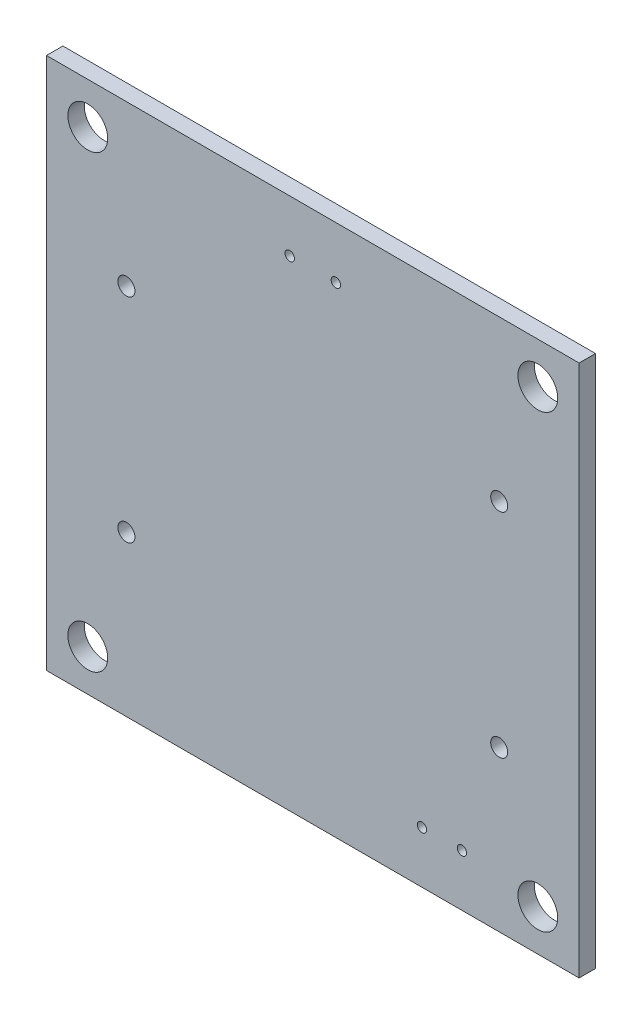
ISO-10303-21;
HEADER;
FILE_DESCRIPTION(('STEP AP214'),'2;1');
FILE_NAME('part.step','',(''),(''),'','','');
FILE_SCHEMA(('AUTOMOTIVE_DESIGN { 1 0 10303 214 1 1 1 1 }'));
ENDSEC;
DATA;
#1=APPLICATION_CONTEXT('core data for automotive mechanical design processes');
#2=APPLICATION_PROTOCOL_DEFINITION('international standard','automotive_design',2000,#1);
#3=PRODUCT_CONTEXT('',#1,'mechanical');
#4=PRODUCT('Part','Part','',(#3));
#5=PRODUCT_RELATED_PRODUCT_CATEGORY('part','',(#4));
#6=PRODUCT_DEFINITION_FORMATION('','',#4);
#7=PRODUCT_DEFINITION_CONTEXT('part definition',#1,'design');
#8=PRODUCT_DEFINITION('design','',#6,#7);
#9=PRODUCT_DEFINITION_SHAPE('','',#8);
#10=(LENGTH_UNIT() NAMED_UNIT(*) SI_UNIT(.MILLI.,.METRE.));
#11=(NAMED_UNIT(*) PLANE_ANGLE_UNIT() SI_UNIT($,.RADIAN.));
#12=(NAMED_UNIT(*) SI_UNIT($,.STERADIAN.) SOLID_ANGLE_UNIT());
#13=UNCERTAINTY_MEASURE_WITH_UNIT(LENGTH_MEASURE(1.E-05),#10,'distance_accuracy_value','');
#14=(GEOMETRIC_REPRESENTATION_CONTEXT(3) GLOBAL_UNCERTAINTY_ASSIGNED_CONTEXT((#13)) GLOBAL_UNIT_ASSIGNED_CONTEXT((#10,
#11,#12)) REPRESENTATION_CONTEXT('',''));
#15=CARTESIAN_POINT('',(0.,0.,0.));
#16=DIRECTION('',(0.,0.,1.));
#17=DIRECTION('',(1.,0.,0.));
#18=AXIS2_PLACEMENT_3D('',#15,#16,#17);
#19=CARTESIAN_POINT('',(0.,0.,1.56464));
#20=DIRECTION('',(0.,0.,1.));
#21=DIRECTION('',(1.,0.,0.));
#22=AXIS2_PLACEMENT_3D('',#19,#20,#21);
#23=PLANE('',#22);
#24=CARTESIAN_POINT('',(46.863,46.863,1.56464));
#25=DIRECTION('',(0.,0.,-1.));
#26=DIRECTION('',(-1.,0.,0.));
#27=AXIS2_PLACEMENT_3D('',#24,#25,#26);
#28=CIRCLE('',#27,1.89999874);
#29=CARTESIAN_POINT('',(44.96300126,46.863,1.56464));
#30=VERTEX_POINT('',#29);
#31=EDGE_CURVE('E115',#30,#30,#28,.T.);
#32=ORIENTED_EDGE('',*,*,#31,.T.);
#33=EDGE_LOOP('',(#32));
#34=FACE_BOUND('',#33,.T.);
#35=CARTESIAN_POINT('',(43.18,35.56,1.56464));
#36=DIRECTION('',(0.,0.,-1.));
#37=DIRECTION('',(-1.,0.,0.));
#38=AXIS2_PLACEMENT_3D('',#35,#36,#37);
#39=CIRCLE('',#38,0.8128);
#40=CARTESIAN_POINT('',(42.3672,35.56,1.56464));
#41=VERTEX_POINT('',#40);
#42=EDGE_CURVE('E118',#41,#41,#39,.T.);
#43=ORIENTED_EDGE('',*,*,#42,.T.);
#44=EDGE_LOOP('',(#43));
#45=FACE_BOUND('',#44,.T.);
#46=CARTESIAN_POINT('',(43.18,15.24,1.56464));
#47=DIRECTION('',(0.,0.,-1.));
#48=DIRECTION('',(-1.,0.,0.));
#49=AXIS2_PLACEMENT_3D('',#46,#47,#48);
#50=CIRCLE('',#49,0.8128);
#51=CARTESIAN_POINT('',(42.3672,15.24,1.56464));
#52=VERTEX_POINT('',#51);
#53=EDGE_CURVE('E121',#52,#52,#50,.T.);
#54=ORIENTED_EDGE('',*,*,#53,.T.);
#55=EDGE_LOOP('',(#54));
#56=FACE_BOUND('',#55,.T.);
#57=CARTESIAN_POINT('',(46.863,3.937,1.56464));
#58=DIRECTION('',(0.,0.,-1.));
#59=DIRECTION('',(-1.,0.,0.));
#60=AXIS2_PLACEMENT_3D('',#57,#58,#59);
#61=CIRCLE('',#60,1.89999874);
#62=CARTESIAN_POINT('',(44.96300126,3.937,1.56464));
#63=VERTEX_POINT('',#62);
#64=EDGE_CURVE('E124',#63,#63,#61,.T.);
#65=ORIENTED_EDGE('',*,*,#64,.T.);
#66=EDGE_LOOP('',(#65));
#67=FACE_BOUND('',#66,.T.);
#68=CARTESIAN_POINT('',(39.624,4.953,1.56464));
#69=DIRECTION('',(0.,0.,-1.));
#70=DIRECTION('',(-1.,0.,0.));
#71=AXIS2_PLACEMENT_3D('',#68,#69,#70);
#72=CIRCLE('',#71,0.4445);
#73=CARTESIAN_POINT('',(39.1795,4.953,1.56464));
#74=VERTEX_POINT('',#73);
#75=EDGE_CURVE('E127',#74,#74,#72,.T.);
#76=ORIENTED_EDGE('',*,*,#75,.T.);
#77=EDGE_LOOP('',(#76));
#78=FACE_BOUND('',#77,.T.);
#79=CARTESIAN_POINT('',(35.814,4.953,1.56464));
#80=DIRECTION('',(0.,0.,-1.));
#81=DIRECTION('',(-1.,0.,0.));
#82=AXIS2_PLACEMENT_3D('',#79,#80,#81);
#83=CIRCLE('',#82,0.4445);
#84=CARTESIAN_POINT('',(35.3695,4.953,1.56464));
#85=VERTEX_POINT('',#84);
#86=EDGE_CURVE('E130',#85,#85,#83,.T.);
#87=ORIENTED_EDGE('',*,*,#86,.T.);
#88=EDGE_LOOP('',(#87));
#89=FACE_BOUND('',#88,.T.);
#90=CARTESIAN_POINT('',(23.19999932,45.847,1.56464));
#91=DIRECTION('',(0.,0.,-1.));
#92=DIRECTION('',(-1.,0.,0.));
#93=AXIS2_PLACEMENT_3D('',#90,#91,#92);
#94=CIRCLE('',#93,0.4499991);
#95=CARTESIAN_POINT('',(22.75000022,45.847,1.56464));
#96=VERTEX_POINT('',#95);
#97=EDGE_CURVE('E133',#96,#96,#94,.T.);
#98=ORIENTED_EDGE('',*,*,#97,.T.);
#99=EDGE_LOOP('',(#98));
#100=FACE_BOUND('',#99,.T.);
#101=CARTESIAN_POINT('',(27.60000068,45.847,1.56464));
#102=DIRECTION('',(0.,0.,-1.));
#103=DIRECTION('',(-1.,0.,0.));
#104=AXIS2_PLACEMENT_3D('',#101,#102,#103);
#105=CIRCLE('',#104,0.4499991);
#106=CARTESIAN_POINT('',(27.15000158,45.847,1.56464));
#107=VERTEX_POINT('',#106);
#108=EDGE_CURVE('E136',#107,#107,#105,.T.);
#109=ORIENTED_EDGE('',*,*,#108,.T.);
#110=EDGE_LOOP('',(#109));
#111=FACE_BOUND('',#110,.T.);
#112=CARTESIAN_POINT('',(3.937,46.863,1.56464));
#113=DIRECTION('',(0.,0.,-1.));
#114=DIRECTION('',(-1.,0.,0.));
#115=AXIS2_PLACEMENT_3D('',#112,#113,#114);
#116=CIRCLE('',#115,1.89999874);
#117=CARTESIAN_POINT('',(2.03700126,46.863,1.56464));
#118=VERTEX_POINT('',#117);
#119=EDGE_CURVE('E139',#118,#118,#116,.T.);
#120=ORIENTED_EDGE('',*,*,#119,.T.);
#121=EDGE_LOOP('',(#120));
#122=FACE_BOUND('',#121,.T.);
#123=CARTESIAN_POINT('',(7.62,35.56,1.56464));
#124=DIRECTION('',(0.,0.,-1.));
#125=DIRECTION('',(-1.,0.,0.));
#126=AXIS2_PLACEMENT_3D('',#123,#124,#125);
#127=CIRCLE('',#126,0.8128);
#128=CARTESIAN_POINT('',(6.8072,35.56,1.56464));
#129=VERTEX_POINT('',#128);
#130=EDGE_CURVE('E142',#129,#129,#127,.T.);
#131=ORIENTED_EDGE('',*,*,#130,.T.);
#132=EDGE_LOOP('',(#131));
#133=FACE_BOUND('',#132,.T.);
#134=CARTESIAN_POINT('',(7.62,15.24,1.56464));
#135=DIRECTION('',(0.,0.,-1.));
#136=DIRECTION('',(-1.,0.,0.));
#137=AXIS2_PLACEMENT_3D('',#134,#135,#136);
#138=CIRCLE('',#137,0.8128);
#139=CARTESIAN_POINT('',(6.8072,15.24,1.56464));
#140=VERTEX_POINT('',#139);
#141=EDGE_CURVE('E144',#140,#140,#138,.T.);
#142=ORIENTED_EDGE('',*,*,#141,.T.);
#143=EDGE_LOOP('',(#142));
#144=FACE_BOUND('',#143,.T.);
#145=CARTESIAN_POINT('',(3.937,3.937,1.56464));
#146=DIRECTION('',(0.,0.,-1.));
#147=DIRECTION('',(-1.,0.,0.));
#148=AXIS2_PLACEMENT_3D('',#145,#146,#147);
#149=CIRCLE('',#148,1.89999874);
#150=CARTESIAN_POINT('',(2.03700126,3.937,1.56464));
#151=VERTEX_POINT('',#150);
#152=EDGE_CURVE('E19',#151,#151,#149,.T.);
#153=ORIENTED_EDGE('',*,*,#152,.T.);
#154=EDGE_LOOP('',(#153));
#155=FACE_BOUND('',#154,.T.);
#156=DIRECTION('',(1.,0.,0.));
#157=VECTOR('',#156,1.);
#158=CARTESIAN_POINT('',(0.,50.8,1.56464));
#159=LINE('',#158,#157);
#160=CARTESIAN_POINT('',(0.,50.8,1.56464));
#161=VERTEX_POINT('',#160);
#162=CARTESIAN_POINT('',(50.8,50.8,1.56464));
#163=VERTEX_POINT('',#162);
#164=EDGE_CURVE('E53',#161,#163,#159,.T.);
#165=ORIENTED_EDGE('',*,*,#164,.F.);
#166=DIRECTION('',(0.,1.,0.));
#167=VECTOR('',#166,1.);
#168=CARTESIAN_POINT('',(0.,0.,1.56464));
#169=LINE('',#168,#167);
#170=CARTESIAN_POINT('',(0.,0.,1.56464));
#171=VERTEX_POINT('',#170);
#172=EDGE_CURVE('E70',#171,#161,#169,.T.);
#173=ORIENTED_EDGE('',*,*,#172,.F.);
#174=DIRECTION('',(1.,0.,0.));
#175=VECTOR('',#174,1.);
#176=CARTESIAN_POINT('',(50.8,0.,1.56464));
#177=LINE('',#176,#175);
#178=CARTESIAN_POINT('',(50.8,0.,1.56464));
#179=VERTEX_POINT('',#178);
#180=EDGE_CURVE('E67',#179,#171,#177,.F.);
#181=ORIENTED_EDGE('',*,*,#180,.F.);
#182=DIRECTION('',(0.,1.,0.));
#183=VECTOR('',#182,1.);
#184=CARTESIAN_POINT('',(50.8,50.8,1.56464));
#185=LINE('',#184,#183);
#186=EDGE_CURVE('E58',#163,#179,#185,.F.);
#187=ORIENTED_EDGE('',*,*,#186,.F.);
#188=EDGE_LOOP('',(#165,#173,#181,#187));
#189=FACE_BOUND('',#188,.T.);
#190=ADVANCED_FACE('F16',(#34,#45,#56,#67,#78,#89,#100,#111,#122,#133,#144,#155,#189),#23,.T.);
#191=CARTESIAN_POINT('',(50.8,0.,0.));
#192=DIRECTION('',(0.,-1.,0.));
#193=DIRECTION('',(0.,0.,-1.));
#194=AXIS2_PLACEMENT_3D('',#191,#192,#193);
#195=PLANE('',#194);
#196=DIRECTION('',(0.,0.,1.));
#197=VECTOR('',#196,1.);
#198=CARTESIAN_POINT('',(0.,0.,0.));
#199=LINE('',#198,#197);
#200=CARTESIAN_POINT('',(0.,0.,0.));
#201=VERTEX_POINT('',#200);
#202=EDGE_CURVE('E152',#201,#171,#199,.T.);
#203=ORIENTED_EDGE('',*,*,#202,.F.);
#204=DIRECTION('',(1.,0.,0.));
#205=VECTOR('',#204,1.);
#206=CARTESIAN_POINT('',(0.,0.,0.));
#207=LINE('',#206,#205);
#208=CARTESIAN_POINT('',(50.8,0.,0.));
#209=VERTEX_POINT('',#208);
#210=EDGE_CURVE('E77',#201,#209,#207,.T.);
#211=ORIENTED_EDGE('',*,*,#210,.T.);
#212=DIRECTION('',(0.,0.,-1.));
#213=VECTOR('',#212,1.);
#214=CARTESIAN_POINT('',(50.8,0.,0.));
#215=LINE('',#214,#213);
#216=EDGE_CURVE('E63',#179,#209,#215,.T.);
#217=ORIENTED_EDGE('',*,*,#216,.F.);
#218=ORIENTED_EDGE('',*,*,#180,.T.);
#219=EDGE_LOOP('',(#203,#211,#217,#218));
#220=FACE_BOUND('',#219,.T.);
#221=ADVANCED_FACE('F76',(#220),#195,.T.);
#222=CARTESIAN_POINT('',(50.8,50.8,0.));
#223=DIRECTION('',(1.,0.,0.));
#224=DIRECTION('',(0.,0.,-1.));
#225=AXIS2_PLACEMENT_3D('',#222,#223,#224);
#226=PLANE('',#225);
#227=ORIENTED_EDGE('',*,*,#216,.T.);
#228=DIRECTION('',(0.,1.,0.));
#229=VECTOR('',#228,1.);
#230=CARTESIAN_POINT('',(50.8,0.,0.));
#231=LINE('',#230,#229);
#232=CARTESIAN_POINT('',(50.8,50.8,0.));
#233=VERTEX_POINT('',#232);
#234=EDGE_CURVE('E163',#209,#233,#231,.T.);
#235=ORIENTED_EDGE('',*,*,#234,.T.);
#236=DIRECTION('',(0.,0.,1.));
#237=VECTOR('',#236,1.);
#238=CARTESIAN_POINT('',(50.8,50.8,0.));
#239=LINE('',#238,#237);
#240=EDGE_CURVE('E65',#163,#233,#239,.F.);
#241=ORIENTED_EDGE('',*,*,#240,.F.);
#242=ORIENTED_EDGE('',*,*,#186,.T.);
#243=EDGE_LOOP('',(#227,#235,#241,#242));
#244=FACE_BOUND('',#243,.T.);
#245=ADVANCED_FACE('F60',(#244),#226,.T.);
#246=CARTESIAN_POINT('',(0.,50.8,0.));
#247=DIRECTION('',(0.,1.,0.));
#248=DIRECTION('',(0.,0.,1.));
#249=AXIS2_PLACEMENT_3D('',#246,#247,#248);
#250=PLANE('',#249);
#251=ORIENTED_EDGE('',*,*,#240,.T.);
#252=DIRECTION('',(1.,0.,0.));
#253=VECTOR('',#252,1.);
#254=CARTESIAN_POINT('',(0.,50.8,0.));
#255=LINE('',#254,#253);
#256=CARTESIAN_POINT('',(0.,50.8,0.));
#257=VERTEX_POINT('',#256);
#258=EDGE_CURVE('E160',#233,#257,#255,.F.);
#259=ORIENTED_EDGE('',*,*,#258,.T.);
#260=DIRECTION('',(0.,0.,1.));
#261=VECTOR('',#260,1.);
#262=CARTESIAN_POINT('',(0.,50.8,0.));
#263=LINE('',#262,#261);
#264=EDGE_CURVE('E34',#161,#257,#263,.F.);
#265=ORIENTED_EDGE('',*,*,#264,.F.);
#266=ORIENTED_EDGE('',*,*,#164,.T.);
#267=EDGE_LOOP('',(#251,#259,#265,#266));
#268=FACE_BOUND('',#267,.T.);
#269=ADVANCED_FACE('F159',(#268),#250,.T.);
#270=CARTESIAN_POINT('',(0.,0.,0.));
#271=DIRECTION('',(-1.,0.,0.));
#272=DIRECTION('',(0.,0.,1.));
#273=AXIS2_PLACEMENT_3D('',#270,#271,#272);
#274=PLANE('',#273);
#275=ORIENTED_EDGE('',*,*,#264,.T.);
#276=DIRECTION('',(0.,1.,0.));
#277=VECTOR('',#276,1.);
#278=CARTESIAN_POINT('',(0.,0.,0.));
#279=LINE('',#278,#277);
#280=EDGE_CURVE('E114',#257,#201,#279,.F.);
#281=ORIENTED_EDGE('',*,*,#280,.T.);
#282=ORIENTED_EDGE('',*,*,#202,.T.);
#283=ORIENTED_EDGE('',*,*,#172,.T.);
#284=EDGE_LOOP('',(#275,#281,#282,#283));
#285=FACE_BOUND('',#284,.T.);
#286=ADVANCED_FACE('F166',(#285),#274,.T.);
#287=CARTESIAN_POINT('',(3.937,3.937,0.));
#288=DIRECTION('',(0.,0.,-1.));
#289=DIRECTION('',(-1.,0.,0.));
#290=AXIS2_PLACEMENT_3D('',#287,#288,#289);
#291=CYLINDRICAL_SURFACE('',#290,1.89999874);
#292=ORIENTED_EDGE('',*,*,#152,.F.);
#293=EDGE_LOOP('',(#292));
#294=FACE_BOUND('',#293,.T.);
#295=CARTESIAN_POINT('',(3.937,3.937,0.));
#296=DIRECTION('',(0.,0.,-1.));
#297=DIRECTION('',(-1.,0.,0.));
#298=AXIS2_PLACEMENT_3D('',#295,#296,#297);
#299=CIRCLE('',#298,1.89999874);
#300=CARTESIAN_POINT('',(2.03700126,3.937,0.));
#301=VERTEX_POINT('',#300);
#302=EDGE_CURVE('E111',#301,#301,#299,.T.);
#303=ORIENTED_EDGE('',*,*,#302,.T.);
#304=EDGE_LOOP('',(#303));
#305=FACE_BOUND('',#304,.T.);
#306=ADVANCED_FACE('F168',(#294,#305),#291,.F.);
#307=CARTESIAN_POINT('',(7.62,15.24,0.));
#308=DIRECTION('',(0.,0.,-1.));
#309=DIRECTION('',(-1.,0.,0.));
#310=AXIS2_PLACEMENT_3D('',#307,#308,#309);
#311=CYLINDRICAL_SURFACE('',#310,0.8128);
#312=ORIENTED_EDGE('',*,*,#141,.F.);
#313=EDGE_LOOP('',(#312));
#314=FACE_BOUND('',#313,.T.);
#315=CARTESIAN_POINT('',(7.62,15.24,0.));
#316=DIRECTION('',(0.,0.,-1.));
#317=DIRECTION('',(-1.,0.,0.));
#318=AXIS2_PLACEMENT_3D('',#315,#316,#317);
#319=CIRCLE('',#318,0.8128);
#320=CARTESIAN_POINT('',(6.8072,15.24,0.));
#321=VERTEX_POINT('',#320);
#322=EDGE_CURVE('E108',#321,#321,#319,.T.);
#323=ORIENTED_EDGE('',*,*,#322,.T.);
#324=EDGE_LOOP('',(#323));
#325=FACE_BOUND('',#324,.T.);
#326=ADVANCED_FACE('F175',(#314,#325),#311,.F.);
#327=CARTESIAN_POINT('',(7.62,35.56,0.));
#328=DIRECTION('',(0.,0.,-1.));
#329=DIRECTION('',(-1.,0.,0.));
#330=AXIS2_PLACEMENT_3D('',#327,#328,#329);
#331=CYLINDRICAL_SURFACE('',#330,0.8128);
#332=ORIENTED_EDGE('',*,*,#130,.F.);
#333=EDGE_LOOP('',(#332));
#334=FACE_BOUND('',#333,.T.);
#335=CARTESIAN_POINT('',(7.62,35.56,0.));
#336=DIRECTION('',(0.,0.,-1.));
#337=DIRECTION('',(-1.,0.,0.));
#338=AXIS2_PLACEMENT_3D('',#335,#336,#337);
#339=CIRCLE('',#338,0.8128);
#340=CARTESIAN_POINT('',(6.8072,35.56,0.));
#341=VERTEX_POINT('',#340);
#342=EDGE_CURVE('E105',#341,#341,#339,.T.);
#343=ORIENTED_EDGE('',*,*,#342,.T.);
#344=EDGE_LOOP('',(#343));
#345=FACE_BOUND('',#344,.T.);
#346=ADVANCED_FACE('F222',(#334,#345),#331,.F.);
#347=CARTESIAN_POINT('',(3.937,46.863,0.));
#348=DIRECTION('',(0.,0.,-1.));
#349=DIRECTION('',(-1.,0.,0.));
#350=AXIS2_PLACEMENT_3D('',#347,#348,#349);
#351=CYLINDRICAL_SURFACE('',#350,1.89999874);
#352=ORIENTED_EDGE('',*,*,#119,.F.);
#353=EDGE_LOOP('',(#352));
#354=FACE_BOUND('',#353,.T.);
#355=CARTESIAN_POINT('',(3.937,46.863,0.));
#356=DIRECTION('',(0.,0.,-1.));
#357=DIRECTION('',(-1.,0.,0.));
#358=AXIS2_PLACEMENT_3D('',#355,#356,#357);
#359=CIRCLE('',#358,1.89999874);
#360=CARTESIAN_POINT('',(2.03700126,46.863,0.));
#361=VERTEX_POINT('',#360);
#362=EDGE_CURVE('E102',#361,#361,#359,.T.);
#363=ORIENTED_EDGE('',*,*,#362,.T.);
#364=EDGE_LOOP('',(#363));
#365=FACE_BOUND('',#364,.T.);
#366=ADVANCED_FACE('F218',(#354,#365),#351,.F.);
#367=CARTESIAN_POINT('',(27.60000068,45.847,0.));
#368=DIRECTION('',(0.,0.,-1.));
#369=DIRECTION('',(-1.,0.,0.));
#370=AXIS2_PLACEMENT_3D('',#367,#368,#369);
#371=CYLINDRICAL_SURFACE('',#370,0.4499991);
#372=ORIENTED_EDGE('',*,*,#108,.F.);
#373=EDGE_LOOP('',(#372));
#374=FACE_BOUND('',#373,.T.);
#375=CARTESIAN_POINT('',(27.60000068,45.847,0.));
#376=DIRECTION('',(0.,0.,-1.));
#377=DIRECTION('',(-1.,0.,0.));
#378=AXIS2_PLACEMENT_3D('',#375,#376,#377);
#379=CIRCLE('',#378,0.4499991);
#380=CARTESIAN_POINT('',(27.15000158,45.847,0.));
#381=VERTEX_POINT('',#380);
#382=EDGE_CURVE('E99',#381,#381,#379,.T.);
#383=ORIENTED_EDGE('',*,*,#382,.T.);
#384=EDGE_LOOP('',(#383));
#385=FACE_BOUND('',#384,.T.);
#386=ADVANCED_FACE('F214',(#374,#385),#371,.F.);
#387=CARTESIAN_POINT('',(23.19999932,45.847,0.));
#388=DIRECTION('',(0.,0.,-1.));
#389=DIRECTION('',(-1.,0.,0.));
#390=AXIS2_PLACEMENT_3D('',#387,#388,#389);
#391=CYLINDRICAL_SURFACE('',#390,0.4499991);
#392=ORIENTED_EDGE('',*,*,#97,.F.);
#393=EDGE_LOOP('',(#392));
#394=FACE_BOUND('',#393,.T.);
#395=CARTESIAN_POINT('',(23.19999932,45.847,0.));
#396=DIRECTION('',(0.,0.,-1.));
#397=DIRECTION('',(-1.,0.,0.));
#398=AXIS2_PLACEMENT_3D('',#395,#396,#397);
#399=CIRCLE('',#398,0.4499991);
#400=CARTESIAN_POINT('',(22.75000022,45.847,0.));
#401=VERTEX_POINT('',#400);
#402=EDGE_CURVE('E96',#401,#401,#399,.T.);
#403=ORIENTED_EDGE('',*,*,#402,.T.);
#404=EDGE_LOOP('',(#403));
#405=FACE_BOUND('',#404,.T.);
#406=ADVANCED_FACE('F210',(#394,#405),#391,.F.);
#407=CARTESIAN_POINT('',(35.814,4.953,0.));
#408=DIRECTION('',(0.,0.,-1.));
#409=DIRECTION('',(-1.,0.,0.));
#410=AXIS2_PLACEMENT_3D('',#407,#408,#409);
#411=CYLINDRICAL_SURFACE('',#410,0.4445);
#412=ORIENTED_EDGE('',*,*,#86,.F.);
#413=EDGE_LOOP('',(#412));
#414=FACE_BOUND('',#413,.T.);
#415=CARTESIAN_POINT('',(35.814,4.953,0.));
#416=DIRECTION('',(0.,0.,-1.));
#417=DIRECTION('',(-1.,0.,0.));
#418=AXIS2_PLACEMENT_3D('',#415,#416,#417);
#419=CIRCLE('',#418,0.4445);
#420=CARTESIAN_POINT('',(35.3695,4.953,0.));
#421=VERTEX_POINT('',#420);
#422=EDGE_CURVE('E93',#421,#421,#419,.T.);
#423=ORIENTED_EDGE('',*,*,#422,.T.);
#424=EDGE_LOOP('',(#423));
#425=FACE_BOUND('',#424,.T.);
#426=ADVANCED_FACE('F206',(#414,#425),#411,.F.);
#427=CARTESIAN_POINT('',(39.624,4.953,0.));
#428=DIRECTION('',(0.,0.,-1.));
#429=DIRECTION('',(-1.,0.,0.));
#430=AXIS2_PLACEMENT_3D('',#427,#428,#429);
#431=CYLINDRICAL_SURFACE('',#430,0.4445);
#432=ORIENTED_EDGE('',*,*,#75,.F.);
#433=EDGE_LOOP('',(#432));
#434=FACE_BOUND('',#433,.T.);
#435=CARTESIAN_POINT('',(39.624,4.953,0.));
#436=DIRECTION('',(0.,0.,-1.));
#437=DIRECTION('',(-1.,0.,0.));
#438=AXIS2_PLACEMENT_3D('',#435,#436,#437);
#439=CIRCLE('',#438,0.4445);
#440=CARTESIAN_POINT('',(39.1795,4.953,0.));
#441=VERTEX_POINT('',#440);
#442=EDGE_CURVE('E90',#441,#441,#439,.T.);
#443=ORIENTED_EDGE('',*,*,#442,.T.);
#444=EDGE_LOOP('',(#443));
#445=FACE_BOUND('',#444,.T.);
#446=ADVANCED_FACE('F202',(#434,#445),#431,.F.);
#447=CARTESIAN_POINT('',(46.863,3.937,0.));
#448=DIRECTION('',(0.,0.,-1.));
#449=DIRECTION('',(-1.,0.,0.));
#450=AXIS2_PLACEMENT_3D('',#447,#448,#449);
#451=CYLINDRICAL_SURFACE('',#450,1.89999874);
#452=ORIENTED_EDGE('',*,*,#64,.F.);
#453=EDGE_LOOP('',(#452));
#454=FACE_BOUND('',#453,.T.);
#455=CARTESIAN_POINT('',(46.863,3.937,0.));
#456=DIRECTION('',(0.,0.,-1.));
#457=DIRECTION('',(-1.,0.,0.));
#458=AXIS2_PLACEMENT_3D('',#455,#456,#457);
#459=CIRCLE('',#458,1.89999874);
#460=CARTESIAN_POINT('',(44.96300126,3.937,0.));
#461=VERTEX_POINT('',#460);
#462=EDGE_CURVE('E87',#461,#461,#459,.T.);
#463=ORIENTED_EDGE('',*,*,#462,.T.);
#464=EDGE_LOOP('',(#463));
#465=FACE_BOUND('',#464,.T.);
#466=ADVANCED_FACE('F198',(#454,#465),#451,.F.);
#467=CARTESIAN_POINT('',(43.18,15.24,0.));
#468=DIRECTION('',(0.,0.,-1.));
#469=DIRECTION('',(-1.,0.,0.));
#470=AXIS2_PLACEMENT_3D('',#467,#468,#469);
#471=CYLINDRICAL_SURFACE('',#470,0.8128);
#472=ORIENTED_EDGE('',*,*,#53,.F.);
#473=EDGE_LOOP('',(#472));
#474=FACE_BOUND('',#473,.T.);
#475=CARTESIAN_POINT('',(43.18,15.24,0.));
#476=DIRECTION('',(0.,0.,-1.));
#477=DIRECTION('',(-1.,0.,0.));
#478=AXIS2_PLACEMENT_3D('',#475,#476,#477);
#479=CIRCLE('',#478,0.8128);
#480=CARTESIAN_POINT('',(42.3672,15.24,0.));
#481=VERTEX_POINT('',#480);
#482=EDGE_CURVE('E84',#481,#481,#479,.T.);
#483=ORIENTED_EDGE('',*,*,#482,.T.);
#484=EDGE_LOOP('',(#483));
#485=FACE_BOUND('',#484,.T.);
#486=ADVANCED_FACE('F194',(#474,#485),#471,.F.);
#487=CARTESIAN_POINT('',(43.18,35.56,0.));
#488=DIRECTION('',(0.,0.,-1.));
#489=DIRECTION('',(-1.,0.,0.));
#490=AXIS2_PLACEMENT_3D('',#487,#488,#489);
#491=CYLINDRICAL_SURFACE('',#490,0.8128);
#492=ORIENTED_EDGE('',*,*,#42,.F.);
#493=EDGE_LOOP('',(#492));
#494=FACE_BOUND('',#493,.T.);
#495=CARTESIAN_POINT('',(43.18,35.56,0.));
#496=DIRECTION('',(0.,0.,-1.));
#497=DIRECTION('',(-1.,0.,0.));
#498=AXIS2_PLACEMENT_3D('',#495,#496,#497);
#499=CIRCLE('',#498,0.8128);
#500=CARTESIAN_POINT('',(42.3672,35.56,0.));
#501=VERTEX_POINT('',#500);
#502=EDGE_CURVE('E25',#501,#501,#499,.T.);
#503=ORIENTED_EDGE('',*,*,#502,.T.);
#504=EDGE_LOOP('',(#503));
#505=FACE_BOUND('',#504,.T.);
#506=ADVANCED_FACE('F186',(#494,#505),#491,.F.);
#507=CARTESIAN_POINT('',(46.863,46.863,0.));
#508=DIRECTION('',(0.,0.,-1.));
#509=DIRECTION('',(-1.,0.,0.));
#510=AXIS2_PLACEMENT_3D('',#507,#508,#509);
#511=CYLINDRICAL_SURFACE('',#510,1.89999874);
#512=ORIENTED_EDGE('',*,*,#31,.F.);
#513=EDGE_LOOP('',(#512));
#514=FACE_BOUND('',#513,.T.);
#515=CARTESIAN_POINT('',(46.863,46.863,0.));
#516=DIRECTION('',(0.,0.,-1.));
#517=DIRECTION('',(-1.,0.,0.));
#518=AXIS2_PLACEMENT_3D('',#515,#516,#517);
#519=CIRCLE('',#518,1.89999874);
#520=CARTESIAN_POINT('',(44.96300126,46.863,0.));
#521=VERTEX_POINT('',#520);
#522=EDGE_CURVE('E10',#521,#521,#519,.T.);
#523=ORIENTED_EDGE('',*,*,#522,.T.);
#524=EDGE_LOOP('',(#523));
#525=FACE_BOUND('',#524,.T.);
#526=ADVANCED_FACE('F180',(#514,#525),#511,.F.);
#527=CARTESIAN_POINT('',(0.,0.,0.));
#528=DIRECTION('',(0.,0.,1.));
#529=DIRECTION('',(1.,0.,0.));
#530=AXIS2_PLACEMENT_3D('',#527,#528,#529);
#531=PLANE('',#530);
#532=ORIENTED_EDGE('',*,*,#522,.F.);
#533=EDGE_LOOP('',(#532));
#534=FACE_BOUND('',#533,.T.);
#535=ORIENTED_EDGE('',*,*,#502,.F.);
#536=EDGE_LOOP('',(#535));
#537=FACE_BOUND('',#536,.T.);
#538=ORIENTED_EDGE('',*,*,#482,.F.);
#539=EDGE_LOOP('',(#538));
#540=FACE_BOUND('',#539,.T.);
#541=ORIENTED_EDGE('',*,*,#462,.F.);
#542=EDGE_LOOP('',(#541));
#543=FACE_BOUND('',#542,.T.);
#544=ORIENTED_EDGE('',*,*,#442,.F.);
#545=EDGE_LOOP('',(#544));
#546=FACE_BOUND('',#545,.T.);
#547=ORIENTED_EDGE('',*,*,#422,.F.);
#548=EDGE_LOOP('',(#547));
#549=FACE_BOUND('',#548,.T.);
#550=ORIENTED_EDGE('',*,*,#402,.F.);
#551=EDGE_LOOP('',(#550));
#552=FACE_BOUND('',#551,.T.);
#553=ORIENTED_EDGE('',*,*,#382,.F.);
#554=EDGE_LOOP('',(#553));
#555=FACE_BOUND('',#554,.T.);
#556=ORIENTED_EDGE('',*,*,#362,.F.);
#557=EDGE_LOOP('',(#556));
#558=FACE_BOUND('',#557,.T.);
#559=ORIENTED_EDGE('',*,*,#342,.F.);
#560=EDGE_LOOP('',(#559));
#561=FACE_BOUND('',#560,.T.);
#562=ORIENTED_EDGE('',*,*,#322,.F.);
#563=EDGE_LOOP('',(#562));
#564=FACE_BOUND('',#563,.T.);
#565=ORIENTED_EDGE('',*,*,#302,.F.);
#566=EDGE_LOOP('',(#565));
#567=FACE_BOUND('',#566,.T.);
#568=ORIENTED_EDGE('',*,*,#258,.F.);
#569=ORIENTED_EDGE('',*,*,#234,.F.);
#570=ORIENTED_EDGE('',*,*,#210,.F.);
#571=ORIENTED_EDGE('',*,*,#280,.F.);
#572=EDGE_LOOP('',(#568,#569,#570,#571));
#573=FACE_BOUND('',#572,.T.);
#574=ADVANCED_FACE('F162',(#534,#537,#540,#543,#546,#549,#552,#555,#558,#561,#564,#567,#573),
#531,.F.);
#575=CLOSED_SHELL('',(#190,#221,#245,#269,#286,#306,#326,#346,#366,#386,#406,#426,#446,#466,
#486,#506,#526,#574));
#576=MANIFOLD_SOLID_BREP('B1',#575);
#577=ADVANCED_BREP_SHAPE_REPRESENTATION('',(#18,#576),#14);
#578=SHAPE_DEFINITION_REPRESENTATION(#9,#577);
ENDSEC;
END-ISO-10303-21;
